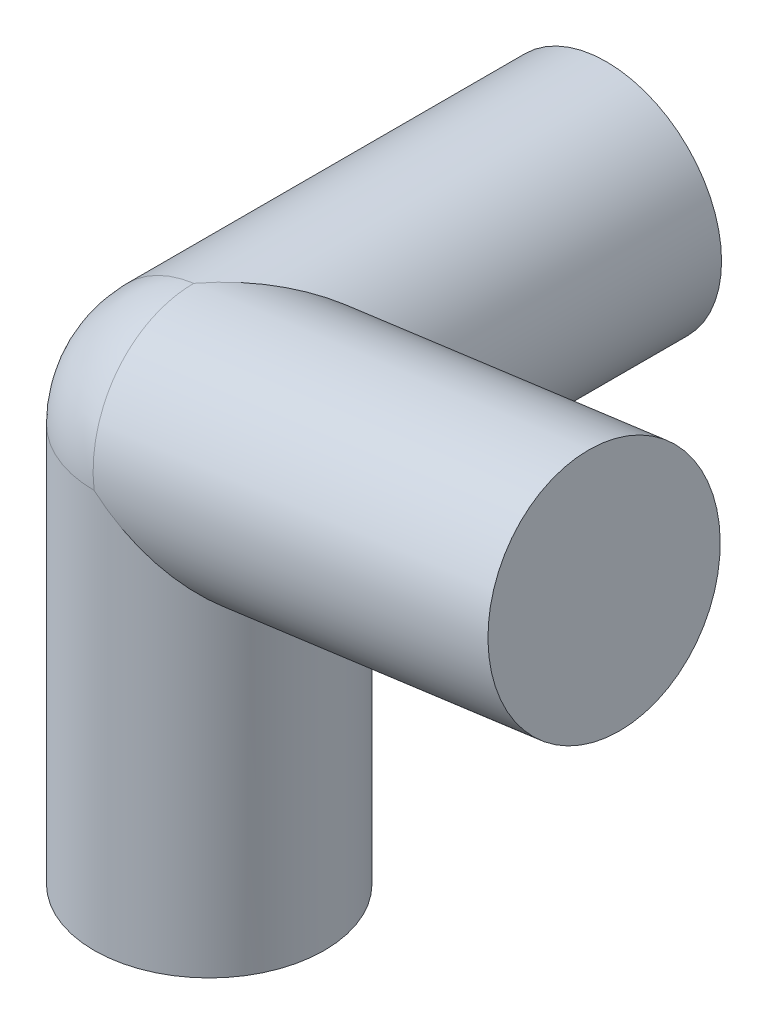
ISO-10303-21;
HEADER;
FILE_DESCRIPTION(('STEP AP214'),'2;1');
FILE_NAME('part.step','',(''),(''),'','','');
FILE_SCHEMA(('AUTOMOTIVE_DESIGN { 1 0 10303 214 1 1 1 1 }'));
ENDSEC;
DATA;
#1=APPLICATION_CONTEXT('core data for automotive mechanical design processes');
#2=APPLICATION_PROTOCOL_DEFINITION('international standard','automotive_design',2000,#1);
#3=PRODUCT_CONTEXT('',#1,'mechanical');
#4=PRODUCT('Part','Part','',(#3));
#5=PRODUCT_RELATED_PRODUCT_CATEGORY('part','',(#4));
#6=PRODUCT_DEFINITION_FORMATION('','',#4);
#7=PRODUCT_DEFINITION_CONTEXT('part definition',#1,'design');
#8=PRODUCT_DEFINITION('design','',#6,#7);
#9=PRODUCT_DEFINITION_SHAPE('','',#8);
#10=(LENGTH_UNIT() NAMED_UNIT(*) SI_UNIT(.MILLI.,.METRE.));
#11=(NAMED_UNIT(*) PLANE_ANGLE_UNIT() SI_UNIT($,.RADIAN.));
#12=(NAMED_UNIT(*) SI_UNIT($,.STERADIAN.) SOLID_ANGLE_UNIT());
#13=UNCERTAINTY_MEASURE_WITH_UNIT(LENGTH_MEASURE(1.E-05),#10,'distance_accuracy_value','');
#14=(GEOMETRIC_REPRESENTATION_CONTEXT(3) GLOBAL_UNCERTAINTY_ASSIGNED_CONTEXT((#13)) GLOBAL_UNIT_ASSIGNED_CONTEXT((#10,
#11,#12)) REPRESENTATION_CONTEXT('',''));
#15=CARTESIAN_POINT('',(0.,0.,0.));
#16=DIRECTION('',(0.,0.,1.));
#17=DIRECTION('',(1.,0.,0.));
#18=AXIS2_PLACEMENT_3D('',#15,#16,#17);
#19=CARTESIAN_POINT('',(39.6884697109233,5.34985641871334,-50.));
#20=DIRECTION('',(-0.991036947957527,-0.133588052545987,0.));
#21=DIRECTION('',(0.133588052545987,-0.991036947957527,0.));
#22=AXIS2_PLACEMENT_3D('',#19,#20,#21);
#23=PLANE('',#22);
#24=CARTESIAN_POINT('',(31.2025918658845,68.3032292691214,14.6326106220573));
#25=DIRECTION('',(-0.991036947957527,-0.133588052545987,0.));
#26=DIRECTION('',(0.133588052545987,-0.991036947957527,0.));
#27=AXIS2_PLACEMENT_3D('',#24,#25,#26);
#28=CIRCLE('',#27,13.);
#29=CARTESIAN_POINT('',(32.9392365489823,55.4197489456736,14.6326106220573));
#30=VERTEX_POINT('',#29);
#31=EDGE_CURVE('E101',#30,#30,#28,.F.);
#32=ORIENTED_EDGE('',*,*,#31,.T.);
#33=EDGE_LOOP('',(#32));
#34=FACE_BOUND('',#33,.T.);
#35=ADVANCED_FACE('F35',(#34),#23,.F.);
#36=CARTESIAN_POINT('',(0.,17.2917669045596,-50.));
#37=DIRECTION('',(0.,1.,0.));
#38=DIRECTION('',(-1.,0.,0.));
#39=AXIS2_PLACEMENT_3D('',#36,#37,#38);
#40=PLANE('',#39);
#41=CARTESIAN_POINT('',(-13.3940707922051,17.2917669045596,14.6326106220572));
#42=DIRECTION('',(0.,1.,0.));
#43=DIRECTION('',(-1.,0.,0.));
#44=AXIS2_PLACEMENT_3D('',#41,#42,#43);
#45=CIRCLE('',#44,13.);
#46=CARTESIAN_POINT('',(-26.3940707922051,17.2917669045596,14.6326106220572));
#47=VERTEX_POINT('',#46);
#48=EDGE_CURVE('E166',#47,#47,#45,.F.);
#49=ORIENTED_EDGE('',*,*,#48,.T.);
#50=EDGE_LOOP('',(#49));
#51=FACE_BOUND('',#50,.T.);
#52=ADVANCED_FACE('F143',(#51),#40,.F.);
#53=CARTESIAN_POINT('',(1581.6059292078,277.29176690456,14.6326106220572));
#54=DIRECTION('',(-0.991036947957525,-0.133588052546004,0.));
#55=DIRECTION('',(0.133588052546004,-0.991036947957525,0.));
#56=AXIS2_PLACEMENT_3D('',#53,#54,#55);
#57=CYLINDRICAL_SURFACE('',#56,13.);
#58=DIRECTION('',(-0.991036947957525,-0.133588052546004,0.));
#59=VECTOR('',#58,1.);
#60=CARTESIAN_POINT('',(1583.34257389089,264.408286581112,14.6326106220572));
#61=LINE('',#60,#59);
#62=CARTESIAN_POINT('',(13.118497589832,52.7479878947535,14.6326106220573));
#63=VERTEX_POINT('',#62);
#64=CARTESIAN_POINT('',(-0.39407079220519,50.9265445078331,14.6326106220573));
#65=VERTEX_POINT('',#64);
#66=EDGE_CURVE('E78',#63,#65,#61,.T.);
#67=ORIENTED_EDGE('',*,*,#66,.T.);
#68=CARTESIAN_POINT('',(-13.3940707922051,62.2917669045511,14.6326106220572));
#69=DIRECTION('',(-0.658183844930121,-0.752857241628851,0.));
#70=DIRECTION('',(-0.752857241628851,0.658183844930121,0.));
#71=AXIS2_PLACEMENT_3D('',#68,#69,#70);
#72=ELLIPSE('',#71,17.2675499167329,13.);
#73=CARTESIAN_POINT('',(-3.60692665103425,53.7353769204633,6.07622063796082));
#74=VERTEX_POINT('',#73);
#75=EDGE_CURVE('E116',#74,#65,#72,.T.);
#76=ORIENTED_EDGE('',*,*,#75,.F.);
#77=CARTESIAN_POINT('',(-13.3940707922046,62.2917669045555,14.6326106220573));
#78=DIRECTION('',(-0.700768946307185,-0.0944610178407843,-0.707106781186547));
#79=DIRECTION('',(-0.700768946307185,-0.0944610178407843,0.707106781186547));
#80=AXIS2_PLACEMENT_3D('',#77,#78,#79);
#81=ELLIPSE('',#80,18.3847763108502,13.);
#82=CARTESIAN_POINT('',(-0.394070792205093,62.2917669045597,1.74913029860829));
#83=VERTEX_POINT('',#82);
#84=EDGE_CURVE('E45',#83,#74,#81,.T.);
#85=ORIENTED_EDGE('',*,*,#84,.F.);
#86=CARTESIAN_POINT('',(-13.3940707922046,62.2917669045555,14.6326106220573));
#87=DIRECTION('',(-0.700768946307185,-0.0944610178407843,-0.707106781186547));
#88=DIRECTION('',(-0.700768946307185,-0.0944610178407843,0.707106781186547));
#89=AXIS2_PLACEMENT_3D('',#86,#87,#88);
#90=ELLIPSE('',#89,18.3847763108502,13.);
#91=CARTESIAN_POINT('',(-15.1307154753024,75.1752472280076,14.6326106220572));
#92=VERTEX_POINT('',#91);
#93=EDGE_CURVE('E96',#92,#83,#90,.T.);
#94=ORIENTED_EDGE('',*,*,#93,.F.);
#95=DIRECTION('',(-0.991036947957525,-0.133588052546004,0.));
#96=VECTOR('',#95,1.);
#97=CARTESIAN_POINT('',(1579.8692845247,290.175247228008,14.6326106220572));
#98=LINE('',#97,#96);
#99=CARTESIAN_POINT('',(9.64520822363635,78.5149485416494,14.6326106220573));
#100=VERTEX_POINT('',#99);
#101=EDGE_CURVE('E92',#100,#92,#98,.T.);
#102=ORIENTED_EDGE('',*,*,#101,.F.);
#103=ORIENTED_EDGE('',*,*,#101,.T.);
#104=CARTESIAN_POINT('',(-13.3940707922046,62.2917669045555,14.6326106220572));
#105=DIRECTION('',(-0.991036947957525,-0.133588052546004,0.));
#106=DIRECTION('',(0.133588052546004,-0.991036947957525,0.));
#107=AXIS2_PLACEMENT_3D('',#104,#105,#106);
#108=CIRCLE('',#107,13.);
#109=CARTESIAN_POINT('',(-13.3940707922044,62.2917669045597,27.6326106220572));
#110=VERTEX_POINT('',#109);
#111=EDGE_CURVE('E39',#110,#92,#108,.T.);
#112=ORIENTED_EDGE('',*,*,#111,.F.);
#113=CARTESIAN_POINT('',(-13.3940707922051,62.2917669045511,14.6326106220572));
#114=DIRECTION('',(-0.658183844930121,-0.752857241628851,0.));
#115=DIRECTION('',(-0.752857241628851,0.658183844930121,0.));
#116=AXIS2_PLACEMENT_3D('',#113,#114,#115);
#117=ELLIPSE('',#116,17.2675499167329,13.);
#118=EDGE_CURVE('E100',#65,#110,#117,.T.);
#119=ORIENTED_EDGE('',*,*,#118,.F.);
#120=ORIENTED_EDGE('',*,*,#66,.F.);
#121=EDGE_LOOP('',(#67,#76,#85,#94,#102,#103,#112,#119,#120));
#122=FACE_BOUND('',#121,.T.);
#123=ORIENTED_EDGE('',*,*,#31,.F.);
#124=EDGE_LOOP('',(#123));
#125=FACE_BOUND('',#124,.T.);
#126=ADVANCED_FACE('F93',(#122,#125),#57,.T.);
#127=CARTESIAN_POINT('',(-13.3940707922051,62.2917669045597,14.6326106220572));
#128=DIRECTION('',(0.,1.,0.));
#129=DIRECTION('',(1.,0.,0.));
#130=AXIS2_PLACEMENT_3D('',#127,#128,#129);
#131=SPHERICAL_SURFACE('',#130,13.);
#132=CARTESIAN_POINT('',(-13.3940707922051,62.2917669045597,14.6326106220572));
#133=DIRECTION('',(0.,1.,0.));
#134=DIRECTION('',(0.,0.,1.));
#135=AXIS2_PLACEMENT_3D('',#132,#133,#134);
#136=CIRCLE('',#135,13.);
#137=CARTESIAN_POINT('',(-26.3940707922051,62.2917669045597,14.6326106220572));
#138=VERTEX_POINT('',#137);
#139=EDGE_CURVE('E11',#138,#110,#136,.T.);
#140=ORIENTED_EDGE('',*,*,#139,.T.);
#141=ORIENTED_EDGE('',*,*,#111,.T.);
#142=CARTESIAN_POINT('',(-13.3940707922051,62.2917669045597,14.6326106220572));
#143=DIRECTION('',(0.,0.,-1.));
#144=DIRECTION('',(-1.,0.,0.));
#145=AXIS2_PLACEMENT_3D('',#142,#143,#144);
#146=CIRCLE('',#145,13.);
#147=EDGE_CURVE('E106',#138,#92,#146,.T.);
#148=ORIENTED_EDGE('',*,*,#147,.F.);
#149=EDGE_LOOP('',(#140,#141,#148));
#150=FACE_BOUND('',#149,.T.);
#151=ADVANCED_FACE('F37',(#150),#131,.T.);
#152=CARTESIAN_POINT('',(-13.3940707922051,62.2917669045597,14.6326106220572));
#153=DIRECTION('',(0.,-1.,0.));
#154=DIRECTION('',(0.,0.,-1.));
#155=AXIS2_PLACEMENT_3D('',#152,#153,#154);
#156=CYLINDRICAL_SURFACE('',#155,13.);
#157=ORIENTED_EDGE('',*,*,#139,.F.);
#158=CARTESIAN_POINT('',(-13.3940707922051,62.2917669045597,14.6326106220572));
#159=DIRECTION('',(0.,0.707106781186547,-0.707106781186547));
#160=DIRECTION('',(0.,-0.707106781186547,-0.707106781186547));
#161=AXIS2_PLACEMENT_3D('',#158,#159,#160);
#162=ELLIPSE('',#161,18.3847763108502,13.);
#163=CARTESIAN_POINT('',(-13.3940707922051,49.2917669045597,1.63261062205722));
#164=VERTEX_POINT('',#163);
#165=EDGE_CURVE('E84',#138,#164,#162,.F.);
#166=ORIENTED_EDGE('',*,*,#165,.T.);
#167=CARTESIAN_POINT('',(-13.3940707922051,62.2917669045597,14.6326106220572));
#168=DIRECTION('',(0.,0.707106781186547,-0.707106781186547));
#169=DIRECTION('',(0.,-0.707106781186547,-0.707106781186547));
#170=AXIS2_PLACEMENT_3D('',#167,#168,#169);
#171=ELLIPSE('',#170,18.3847763108502,13.);
#172=EDGE_CURVE('E112',#164,#74,#171,.F.);
#173=ORIENTED_EDGE('',*,*,#172,.T.);
#174=ORIENTED_EDGE('',*,*,#75,.T.);
#175=ORIENTED_EDGE('',*,*,#118,.T.);
#176=EDGE_LOOP('',(#157,#166,#173,#174,#175));
#177=FACE_BOUND('',#176,.T.);
#178=ORIENTED_EDGE('',*,*,#48,.F.);
#179=EDGE_LOOP('',(#178));
#180=FACE_BOUND('',#179,.T.);
#181=ADVANCED_FACE('F130',(#177,#180),#156,.T.);
#182=CARTESIAN_POINT('',(-13.3940707922051,62.2917669045597,14.6326106220572));
#183=DIRECTION('',(0.,0.,-1.));
#184=DIRECTION('',(-1.,0.,0.));
#185=AXIS2_PLACEMENT_3D('',#182,#183,#184);
#186=CYLINDRICAL_SURFACE('',#185,13.);
#187=ORIENTED_EDGE('',*,*,#165,.F.);
#188=ORIENTED_EDGE('',*,*,#147,.T.);
#189=ORIENTED_EDGE('',*,*,#93,.T.);
#190=DIRECTION('',(0.,0.,-1.));
#191=VECTOR('',#190,1.);
#192=CARTESIAN_POINT('',(-0.394070792205093,62.2917669045597,14.6326106220572));
#193=LINE('',#192,#191);
#194=CARTESIAN_POINT('',(-0.394070792205093,62.2917669045597,-10.2329435973053));
#195=VERTEX_POINT('',#194);
#196=EDGE_CURVE('E52',#83,#195,#193,.T.);
#197=ORIENTED_EDGE('',*,*,#196,.T.);
#198=ORIENTED_EDGE('',*,*,#196,.F.);
#199=ORIENTED_EDGE('',*,*,#84,.T.);
#200=ORIENTED_EDGE('',*,*,#172,.F.);
#201=EDGE_LOOP('',(#187,#188,#189,#197,#198,#199,#200));
#202=FACE_BOUND('',#201,.T.);
#203=CARTESIAN_POINT('',(-13.3940707922051,62.2917669045597,-30.2329435973052));
#204=DIRECTION('',(0.,0.,-1.));
#205=DIRECTION('',(-1.,0.,0.));
#206=AXIS2_PLACEMENT_3D('',#203,#204,#205);
#207=CIRCLE('',#206,13.);
#208=CARTESIAN_POINT('',(-26.3940707922051,62.2917669045597,-30.2329435973052));
#209=VERTEX_POINT('',#208);
#210=EDGE_CURVE('E165',#209,#209,#207,.T.);
#211=ORIENTED_EDGE('',*,*,#210,.F.);
#212=EDGE_LOOP('',(#211));
#213=FACE_BOUND('',#212,.T.);
#214=ADVANCED_FACE('F128',(#202,#213),#186,.T.);
#215=CARTESIAN_POINT('',(-50.,100.,-30.2329435973052));
#216=DIRECTION('',(0.,0.,1.));
#217=DIRECTION('',(0.,-1.,0.));
#218=AXIS2_PLACEMENT_3D('',#215,#216,#217);
#219=PLANE('',#218);
#220=ORIENTED_EDGE('',*,*,#210,.T.);
#221=EDGE_LOOP('',(#220));
#222=FACE_BOUND('',#221,.T.);
#223=ADVANCED_FACE('F156',(#222),#219,.F.);
#224=CLOSED_SHELL('',(#35,#52,#126,#151,#181,#214,#223));
#225=MANIFOLD_SOLID_BREP('B2',#224);
#226=ADVANCED_BREP_SHAPE_REPRESENTATION('',(#18,#225),#14);
#227=SHAPE_DEFINITION_REPRESENTATION(#9,#226);
ENDSEC;
END-ISO-10303-21;
